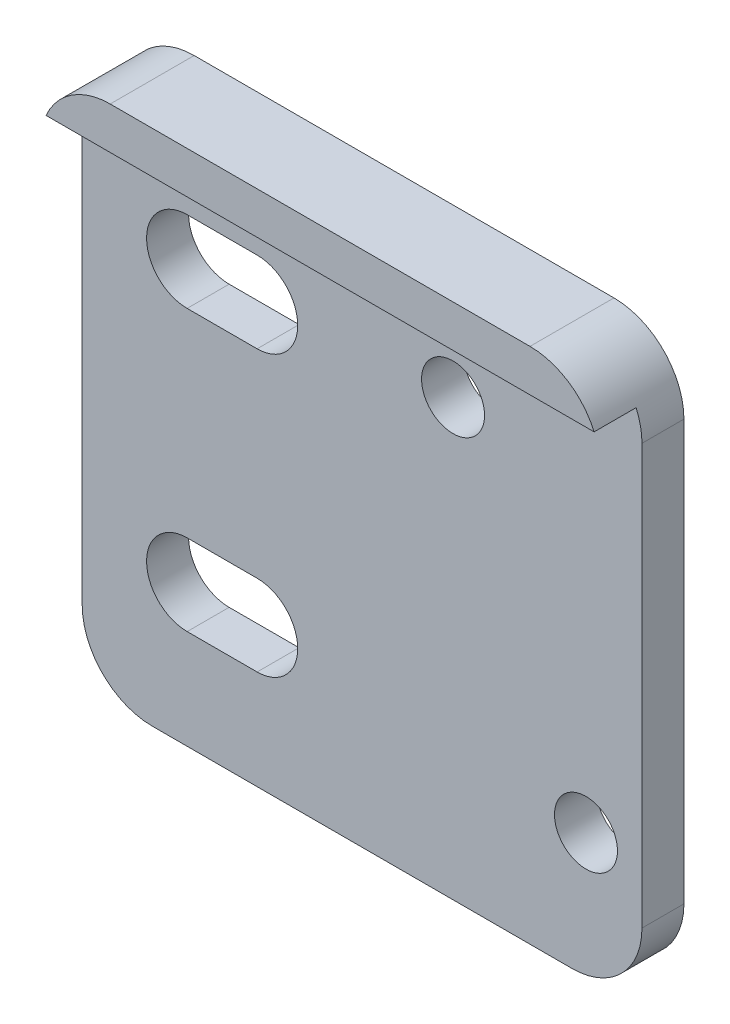
ISO-10303-21;
HEADER;
FILE_DESCRIPTION(('STEP AP214'),'2;1');
FILE_NAME('part.step','',(''),(''),'','','');
FILE_SCHEMA(('AUTOMOTIVE_DESIGN { 1 0 10303 214 1 1 1 1 }'));
ENDSEC;
DATA;
#1=APPLICATION_CONTEXT('core data for automotive mechanical design processes');
#2=APPLICATION_PROTOCOL_DEFINITION('international standard','automotive_design',2000,#1);
#3=PRODUCT_CONTEXT('',#1,'mechanical');
#4=PRODUCT('Part','Part','',(#3));
#5=PRODUCT_RELATED_PRODUCT_CATEGORY('part','',(#4));
#6=PRODUCT_DEFINITION_FORMATION('','',#4);
#7=PRODUCT_DEFINITION_CONTEXT('part definition',#1,'design');
#8=PRODUCT_DEFINITION('design','',#6,#7);
#9=PRODUCT_DEFINITION_SHAPE('','',#8);
#10=(LENGTH_UNIT() NAMED_UNIT(*) SI_UNIT(.MILLI.,.METRE.));
#11=(NAMED_UNIT(*) PLANE_ANGLE_UNIT() SI_UNIT($,.RADIAN.));
#12=(NAMED_UNIT(*) SI_UNIT($,.STERADIAN.) SOLID_ANGLE_UNIT());
#13=UNCERTAINTY_MEASURE_WITH_UNIT(LENGTH_MEASURE(1.E-05),#10,'distance_accuracy_value','');
#14=(GEOMETRIC_REPRESENTATION_CONTEXT(3) GLOBAL_UNCERTAINTY_ASSIGNED_CONTEXT((#13)) GLOBAL_UNIT_ASSIGNED_CONTEXT((#10,
#11,#12)) REPRESENTATION_CONTEXT('',''));
#15=CARTESIAN_POINT('',(0.,0.,0.));
#16=DIRECTION('',(0.,0.,1.));
#17=DIRECTION('',(1.,0.,0.));
#18=AXIS2_PLACEMENT_3D('',#15,#16,#17);
#19=CARTESIAN_POINT('',(0.,0.,3.));
#20=DIRECTION('',(0.,0.,-1.));
#21=DIRECTION('',(-1.,0.,0.));
#22=AXIS2_PLACEMENT_3D('',#19,#20,#21);
#23=PLANE('',#22);
#24=CARTESIAN_POINT('',(36.,8.9,3.));
#25=DIRECTION('',(0.,0.,1.));
#26=DIRECTION('',(1.,0.,0.));
#27=AXIS2_PLACEMENT_3D('',#24,#25,#26);
#28=CIRCLE('',#27,2.25);
#29=CARTESIAN_POINT('',(38.25,8.9,3.));
#30=VERTEX_POINT('',#29);
#31=EDGE_CURVE('E415',#30,#30,#28,.T.);
#32=ORIENTED_EDGE('',*,*,#31,.F.);
#33=EDGE_LOOP('',(#32));
#34=FACE_BOUND('',#33,.T.);
#35=CARTESIAN_POINT('',(26.5,31.1,3.));
#36=DIRECTION('',(0.,0.,1.));
#37=DIRECTION('',(1.,0.,0.));
#38=AXIS2_PLACEMENT_3D('',#35,#36,#37);
#39=CIRCLE('',#38,2.25);
#40=CARTESIAN_POINT('',(28.75,31.1,3.));
#41=VERTEX_POINT('',#40);
#42=EDGE_CURVE('E407',#41,#41,#39,.T.);
#43=ORIENTED_EDGE('',*,*,#42,.F.);
#44=EDGE_LOOP('',(#43));
#45=FACE_BOUND('',#44,.T.);
#46=CARTESIAN_POINT('',(7.5,10.,3.));
#47=DIRECTION('',(0.,0.,1.));
#48=DIRECTION('',(1.,0.,0.));
#49=AXIS2_PLACEMENT_3D('',#46,#47,#48);
#50=CIRCLE('',#49,2.89999999999999);
#51=CARTESIAN_POINT('',(7.5,12.9,3.));
#52=VERTEX_POINT('',#51);
#53=CARTESIAN_POINT('',(7.5,7.1,3.));
#54=VERTEX_POINT('',#53);
#55=EDGE_CURVE('E381',#52,#54,#50,.T.);
#56=ORIENTED_EDGE('',*,*,#55,.F.);
#57=DIRECTION('',(1.,0.,0.));
#58=VECTOR('',#57,1.);
#59=CARTESIAN_POINT('',(7.5,12.9,3.));
#60=LINE('',#59,#58);
#61=CARTESIAN_POINT('',(12.5,12.9,3.));
#62=VERTEX_POINT('',#61);
#63=EDGE_CURVE('E382',#52,#62,#60,.T.);
#64=ORIENTED_EDGE('',*,*,#63,.T.);
#65=CARTESIAN_POINT('',(12.5,10.,3.));
#66=DIRECTION('',(0.,0.,1.));
#67=DIRECTION('',(1.,0.,0.));
#68=AXIS2_PLACEMENT_3D('',#65,#66,#67);
#69=CIRCLE('',#68,2.89999999999999);
#70=CARTESIAN_POINT('',(12.5,7.10000000000001,3.));
#71=VERTEX_POINT('',#70);
#72=EDGE_CURVE('E393',#71,#62,#69,.T.);
#73=ORIENTED_EDGE('',*,*,#72,.F.);
#74=DIRECTION('',(1.,0.,0.));
#75=VECTOR('',#74,1.);
#76=CARTESIAN_POINT('',(7.5,7.10000000000001,3.));
#77=LINE('',#76,#75);
#78=EDGE_CURVE('E372',#54,#71,#77,.T.);
#79=ORIENTED_EDGE('',*,*,#78,.F.);
#80=EDGE_LOOP('',(#56,#64,#73,#79));
#81=FACE_BOUND('',#80,.T.);
#82=DIRECTION('',(1.,0.,0.));
#83=VECTOR('',#82,1.);
#84=CARTESIAN_POINT('',(7.5,27.1,3.));
#85=LINE('',#84,#83);
#86=CARTESIAN_POINT('',(7.5,27.1,3.));
#87=VERTEX_POINT('',#86);
#88=CARTESIAN_POINT('',(12.5,27.1,3.));
#89=VERTEX_POINT('',#88);
#90=EDGE_CURVE('E336',#87,#89,#85,.T.);
#91=ORIENTED_EDGE('',*,*,#90,.F.);
#92=CARTESIAN_POINT('',(7.5,30.,3.));
#93=DIRECTION('',(0.,0.,1.));
#94=DIRECTION('',(1.,0.,0.));
#95=AXIS2_PLACEMENT_3D('',#92,#93,#94);
#96=CIRCLE('',#95,2.89999999999999);
#97=CARTESIAN_POINT('',(7.5,32.9,3.));
#98=VERTEX_POINT('',#97);
#99=EDGE_CURVE('E355',#98,#87,#96,.T.);
#100=ORIENTED_EDGE('',*,*,#99,.F.);
#101=DIRECTION('',(1.,0.,0.));
#102=VECTOR('',#101,1.);
#103=CARTESIAN_POINT('',(7.5,32.9,3.));
#104=LINE('',#103,#102);
#105=CARTESIAN_POINT('',(12.5,32.9,3.));
#106=VERTEX_POINT('',#105);
#107=EDGE_CURVE('E348',#98,#106,#104,.T.);
#108=ORIENTED_EDGE('',*,*,#107,.T.);
#109=CARTESIAN_POINT('',(12.5,30.,3.));
#110=DIRECTION('',(0.,0.,1.));
#111=DIRECTION('',(1.,0.,0.));
#112=AXIS2_PLACEMENT_3D('',#109,#110,#111);
#113=CIRCLE('',#112,2.89999999999999);
#114=EDGE_CURVE('E361',#89,#106,#113,.T.);
#115=ORIENTED_EDGE('',*,*,#114,.F.);
#116=EDGE_LOOP('',(#91,#100,#108,#115));
#117=FACE_BOUND('',#116,.T.);
#118=DIRECTION('',(1.,0.,0.));
#119=VECTOR('',#118,1.);
#120=CARTESIAN_POINT('',(0.417424305044159,37.,3.));
#121=LINE('',#120,#119);
#122=CARTESIAN_POINT('',(0.417424305044159,37.,3.));
#123=VERTEX_POINT('',#122);
#124=CARTESIAN_POINT('',(39.5825756949558,37.,3.));
#125=VERTEX_POINT('',#124);
#126=EDGE_CURVE('E201',#123,#125,#121,.T.);
#127=ORIENTED_EDGE('',*,*,#126,.F.);
#128=CARTESIAN_POINT('',(5.,35.,3.));
#129=DIRECTION('',(0.,0.,-1.));
#130=DIRECTION('',(-1.,0.,0.));
#131=AXIS2_PLACEMENT_3D('',#128,#129,#130);
#132=CIRCLE('',#131,5.);
#133=CARTESIAN_POINT('',(0.,35.,3.));
#134=VERTEX_POINT('',#133);
#135=EDGE_CURVE('E340',#123,#134,#132,.F.);
#136=ORIENTED_EDGE('',*,*,#135,.T.);
#137=DIRECTION('',(0.,-1.,0.));
#138=VECTOR('',#137,1.);
#139=CARTESIAN_POINT('',(0.,0.,3.));
#140=LINE('',#139,#138);
#141=CARTESIAN_POINT('',(0.,5.,3.));
#142=VERTEX_POINT('',#141);
#143=EDGE_CURVE('E416',#134,#142,#140,.T.);
#144=ORIENTED_EDGE('',*,*,#143,.T.);
#145=CARTESIAN_POINT('',(5.,5.,3.));
#146=DIRECTION('',(0.,0.,-1.));
#147=DIRECTION('',(-1.,0.,0.));
#148=AXIS2_PLACEMENT_3D('',#145,#146,#147);
#149=CIRCLE('',#148,5.);
#150=CARTESIAN_POINT('',(5.,0.,3.));
#151=VERTEX_POINT('',#150);
#152=EDGE_CURVE('E457',#142,#151,#149,.F.);
#153=ORIENTED_EDGE('',*,*,#152,.T.);
#154=DIRECTION('',(1.,0.,0.));
#155=VECTOR('',#154,1.);
#156=CARTESIAN_POINT('',(0.,0.,3.));
#157=LINE('',#156,#155);
#158=CARTESIAN_POINT('',(35.,0.,3.));
#159=VERTEX_POINT('',#158);
#160=EDGE_CURVE('E422',#151,#159,#157,.T.);
#161=ORIENTED_EDGE('',*,*,#160,.T.);
#162=CARTESIAN_POINT('',(35.,5.,3.));
#163=DIRECTION('',(0.,0.,-1.));
#164=DIRECTION('',(-1.,0.,0.));
#165=AXIS2_PLACEMENT_3D('',#162,#163,#164);
#166=CIRCLE('',#165,5.);
#167=CARTESIAN_POINT('',(40.,5.,3.));
#168=VERTEX_POINT('',#167);
#169=EDGE_CURVE('E459',#159,#168,#166,.F.);
#170=ORIENTED_EDGE('',*,*,#169,.T.);
#171=DIRECTION('',(0.,1.,0.));
#172=VECTOR('',#171,1.);
#173=CARTESIAN_POINT('',(40.,0.,3.));
#174=LINE('',#173,#172);
#175=CARTESIAN_POINT('',(40.,35.,3.));
#176=VERTEX_POINT('',#175);
#177=EDGE_CURVE('E424',#168,#176,#174,.T.);
#178=ORIENTED_EDGE('',*,*,#177,.T.);
#179=CARTESIAN_POINT('',(35.,35.,3.));
#180=DIRECTION('',(0.,0.,-1.));
#181=DIRECTION('',(-1.,0.,0.));
#182=AXIS2_PLACEMENT_3D('',#179,#180,#181);
#183=CIRCLE('',#182,5.);
#184=EDGE_CURVE('E458',#176,#125,#183,.F.);
#185=ORIENTED_EDGE('',*,*,#184,.T.);
#186=EDGE_LOOP('',(#127,#136,#144,#153,#161,#170,#178,#185));
#187=FACE_BOUND('',#186,.T.);
#188=ADVANCED_FACE('F186',(#34,#45,#81,#117,#187),#23,.F.);
#189=CARTESIAN_POINT('',(0.,0.,0.));
#190=DIRECTION('',(0.,0.,-1.));
#191=DIRECTION('',(-1.,0.,0.));
#192=AXIS2_PLACEMENT_3D('',#189,#190,#191);
#193=PLANE('',#192);
#194=CARTESIAN_POINT('',(12.5,10.,0.));
#195=DIRECTION('',(0.,0.,1.));
#196=DIRECTION('',(1.,0.,0.));
#197=AXIS2_PLACEMENT_3D('',#194,#195,#196);
#198=CIRCLE('',#197,2.89999999999999);
#199=CARTESIAN_POINT('',(12.5,7.1,0.));
#200=VERTEX_POINT('',#199);
#201=CARTESIAN_POINT('',(12.5,12.9,0.));
#202=VERTEX_POINT('',#201);
#203=EDGE_CURVE('E400',#200,#202,#198,.T.);
#204=ORIENTED_EDGE('',*,*,#203,.T.);
#205=DIRECTION('',(1.,0.,0.));
#206=VECTOR('',#205,1.);
#207=CARTESIAN_POINT('',(7.5,12.9,0.));
#208=LINE('',#207,#206);
#209=CARTESIAN_POINT('',(7.5,12.9,0.));
#210=VERTEX_POINT('',#209);
#211=EDGE_CURVE('E378',#210,#202,#208,.T.);
#212=ORIENTED_EDGE('',*,*,#211,.F.);
#213=CARTESIAN_POINT('',(7.5,10.,0.));
#214=DIRECTION('',(0.,0.,1.));
#215=DIRECTION('',(1.,0.,0.));
#216=AXIS2_PLACEMENT_3D('',#213,#214,#215);
#217=CIRCLE('',#216,2.89999999999999);
#218=CARTESIAN_POINT('',(7.5,7.1,0.));
#219=VERTEX_POINT('',#218);
#220=EDGE_CURVE('E387',#210,#219,#217,.T.);
#221=ORIENTED_EDGE('',*,*,#220,.T.);
#222=DIRECTION('',(1.,0.,0.));
#223=VECTOR('',#222,1.);
#224=CARTESIAN_POINT('',(7.5,7.1,0.));
#225=LINE('',#224,#223);
#226=EDGE_CURVE('E376',#219,#200,#225,.T.);
#227=ORIENTED_EDGE('',*,*,#226,.T.);
#228=EDGE_LOOP('',(#204,#212,#221,#227));
#229=FACE_BOUND('',#228,.T.);
#230=CARTESIAN_POINT('',(26.5,31.1,0.));
#231=DIRECTION('',(0.,0.,1.));
#232=DIRECTION('',(1.,0.,0.));
#233=AXIS2_PLACEMENT_3D('',#230,#231,#232);
#234=CIRCLE('',#233,2.25);
#235=CARTESIAN_POINT('',(28.75,31.1,0.));
#236=VERTEX_POINT('',#235);
#237=EDGE_CURVE('E406',#236,#236,#234,.T.);
#238=ORIENTED_EDGE('',*,*,#237,.T.);
#239=EDGE_LOOP('',(#238));
#240=FACE_BOUND('',#239,.T.);
#241=CARTESIAN_POINT('',(36.,8.9,0.));
#242=DIRECTION('',(0.,0.,1.));
#243=DIRECTION('',(1.,0.,0.));
#244=AXIS2_PLACEMENT_3D('',#241,#242,#243);
#245=CIRCLE('',#244,2.25);
#246=CARTESIAN_POINT('',(38.25,8.9,0.));
#247=VERTEX_POINT('',#246);
#248=EDGE_CURVE('E413',#247,#247,#245,.T.);
#249=ORIENTED_EDGE('',*,*,#248,.T.);
#250=EDGE_LOOP('',(#249));
#251=FACE_BOUND('',#250,.T.);
#252=DIRECTION('',(-1.,0.,0.));
#253=VECTOR('',#252,1.);
#254=CARTESIAN_POINT('',(0.,40.,0.));
#255=LINE('',#254,#253);
#256=CARTESIAN_POINT('',(35.,40.,0.));
#257=VERTEX_POINT('',#256);
#258=CARTESIAN_POINT('',(5.,40.,0.));
#259=VERTEX_POINT('',#258);
#260=EDGE_CURVE('E421',#257,#259,#255,.T.);
#261=ORIENTED_EDGE('',*,*,#260,.F.);
#262=CARTESIAN_POINT('',(35.,35.,0.));
#263=DIRECTION('',(0.,0.,-1.));
#264=DIRECTION('',(-1.,0.,0.));
#265=AXIS2_PLACEMENT_3D('',#262,#263,#264);
#266=CIRCLE('',#265,5.);
#267=CARTESIAN_POINT('',(40.,35.,0.));
#268=VERTEX_POINT('',#267);
#269=EDGE_CURVE('E449',#257,#268,#266,.T.);
#270=ORIENTED_EDGE('',*,*,#269,.T.);
#271=DIRECTION('',(0.,1.,0.));
#272=VECTOR('',#271,1.);
#273=CARTESIAN_POINT('',(40.,0.,0.));
#274=LINE('',#273,#272);
#275=CARTESIAN_POINT('',(40.,5.,0.));
#276=VERTEX_POINT('',#275);
#277=EDGE_CURVE('E433',#276,#268,#274,.T.);
#278=ORIENTED_EDGE('',*,*,#277,.F.);
#279=CARTESIAN_POINT('',(35.,5.,0.));
#280=DIRECTION('',(0.,0.,-1.));
#281=DIRECTION('',(-1.,0.,0.));
#282=AXIS2_PLACEMENT_3D('',#279,#280,#281);
#283=CIRCLE('',#282,5.);
#284=CARTESIAN_POINT('',(35.,0.,0.));
#285=VERTEX_POINT('',#284);
#286=EDGE_CURVE('E447',#276,#285,#283,.T.);
#287=ORIENTED_EDGE('',*,*,#286,.T.);
#288=DIRECTION('',(1.,0.,0.));
#289=VECTOR('',#288,1.);
#290=CARTESIAN_POINT('',(0.,0.,0.));
#291=LINE('',#290,#289);
#292=CARTESIAN_POINT('',(5.,0.,0.));
#293=VERTEX_POINT('',#292);
#294=EDGE_CURVE('E431',#293,#285,#291,.T.);
#295=ORIENTED_EDGE('',*,*,#294,.F.);
#296=CARTESIAN_POINT('',(5.,5.,0.));
#297=DIRECTION('',(0.,0.,-1.));
#298=DIRECTION('',(-1.,0.,0.));
#299=AXIS2_PLACEMENT_3D('',#296,#297,#298);
#300=CIRCLE('',#299,5.);
#301=CARTESIAN_POINT('',(0.,5.,0.));
#302=VERTEX_POINT('',#301);
#303=EDGE_CURVE('E443',#293,#302,#300,.T.);
#304=ORIENTED_EDGE('',*,*,#303,.T.);
#305=DIRECTION('',(0.,-1.,0.));
#306=VECTOR('',#305,1.);
#307=CARTESIAN_POINT('',(0.,0.,0.));
#308=LINE('',#307,#306);
#309=CARTESIAN_POINT('',(0.,35.,0.));
#310=VERTEX_POINT('',#309);
#311=EDGE_CURVE('E420',#310,#302,#308,.T.);
#312=ORIENTED_EDGE('',*,*,#311,.F.);
#313=CARTESIAN_POINT('',(5.,35.,0.));
#314=DIRECTION('',(0.,0.,-1.));
#315=DIRECTION('',(-1.,0.,0.));
#316=AXIS2_PLACEMENT_3D('',#313,#314,#315);
#317=CIRCLE('',#316,5.);
#318=EDGE_CURVE('E445',#310,#259,#317,.T.);
#319=ORIENTED_EDGE('',*,*,#318,.T.);
#320=EDGE_LOOP('',(#261,#270,#278,#287,#295,#304,#312,#319));
#321=FACE_BOUND('',#320,.T.);
#322=DIRECTION('',(1.,0.,0.));
#323=VECTOR('',#322,1.);
#324=CARTESIAN_POINT('',(7.5,32.9,0.));
#325=LINE('',#324,#323);
#326=CARTESIAN_POINT('',(7.5,32.9,0.));
#327=VERTEX_POINT('',#326);
#328=CARTESIAN_POINT('',(12.5,32.9,0.));
#329=VERTEX_POINT('',#328);
#330=EDGE_CURVE('E350',#327,#329,#325,.T.);
#331=ORIENTED_EDGE('',*,*,#330,.F.);
#332=CARTESIAN_POINT('',(7.5,30.,0.));
#333=DIRECTION('',(0.,0.,1.));
#334=DIRECTION('',(1.,0.,0.));
#335=AXIS2_PLACEMENT_3D('',#332,#333,#334);
#336=CIRCLE('',#335,2.89999999999999);
#337=CARTESIAN_POINT('',(7.5,27.1,0.));
#338=VERTEX_POINT('',#337);
#339=EDGE_CURVE('E358',#327,#338,#336,.T.);
#340=ORIENTED_EDGE('',*,*,#339,.T.);
#341=DIRECTION('',(1.,0.,0.));
#342=VECTOR('',#341,1.);
#343=CARTESIAN_POINT('',(7.5,27.1,0.));
#344=LINE('',#343,#342);
#345=CARTESIAN_POINT('',(12.5,27.1,0.));
#346=VERTEX_POINT('',#345);
#347=EDGE_CURVE('E338',#338,#346,#344,.T.);
#348=ORIENTED_EDGE('',*,*,#347,.T.);
#349=CARTESIAN_POINT('',(12.5,30.,0.));
#350=DIRECTION('',(0.,0.,1.));
#351=DIRECTION('',(1.,0.,0.));
#352=AXIS2_PLACEMENT_3D('',#349,#350,#351);
#353=CIRCLE('',#352,2.89999999999999);
#354=EDGE_CURVE('E362',#346,#329,#353,.T.);
#355=ORIENTED_EDGE('',*,*,#354,.T.);
#356=EDGE_LOOP('',(#331,#340,#348,#355));
#357=FACE_BOUND('',#356,.T.);
#358=ADVANCED_FACE('F474',(#229,#240,#251,#321,#357),#193,.T.);
#359=CARTESIAN_POINT('',(0.,0.,3.));
#360=DIRECTION('',(1.,0.,0.));
#361=DIRECTION('',(0.,0.,-1.));
#362=AXIS2_PLACEMENT_3D('',#359,#360,#361);
#363=PLANE('',#362);
#364=ORIENTED_EDGE('',*,*,#311,.T.);
#365=DIRECTION('',(0.,0.,-1.));
#366=VECTOR('',#365,1.);
#367=CARTESIAN_POINT('',(0.,5.,3.));
#368=LINE('',#367,#366);
#369=EDGE_CURVE('E13',#302,#142,#368,.F.);
#370=ORIENTED_EDGE('',*,*,#369,.T.);
#371=ORIENTED_EDGE('',*,*,#143,.F.);
#372=DIRECTION('',(0.,0.,-1.));
#373=VECTOR('',#372,1.);
#374=CARTESIAN_POINT('',(0.,35.,3.));
#375=LINE('',#374,#373);
#376=EDGE_CURVE('E200',#134,#310,#375,.T.);
#377=ORIENTED_EDGE('',*,*,#376,.T.);
#378=EDGE_LOOP('',(#364,#370,#371,#377));
#379=FACE_BOUND('',#378,.T.);
#380=ADVANCED_FACE('F469',(#379),#363,.F.);
#381=CARTESIAN_POINT('',(0.,0.,3.));
#382=DIRECTION('',(0.,1.,0.));
#383=DIRECTION('',(0.,0.,1.));
#384=AXIS2_PLACEMENT_3D('',#381,#382,#383);
#385=PLANE('',#384);
#386=ORIENTED_EDGE('',*,*,#294,.T.);
#387=DIRECTION('',(0.,0.,-1.));
#388=VECTOR('',#387,1.);
#389=CARTESIAN_POINT('',(35.,0.,3.));
#390=LINE('',#389,#388);
#391=EDGE_CURVE('E215',#285,#159,#390,.F.);
#392=ORIENTED_EDGE('',*,*,#391,.T.);
#393=ORIENTED_EDGE('',*,*,#160,.F.);
#394=DIRECTION('',(0.,0.,-1.));
#395=VECTOR('',#394,1.);
#396=CARTESIAN_POINT('',(5.,0.,3.));
#397=LINE('',#396,#395);
#398=EDGE_CURVE('E464',#151,#293,#397,.T.);
#399=ORIENTED_EDGE('',*,*,#398,.T.);
#400=EDGE_LOOP('',(#386,#392,#393,#399));
#401=FACE_BOUND('',#400,.T.);
#402=ADVANCED_FACE('F478',(#401),#385,.F.);
#403=CARTESIAN_POINT('',(40.,0.,3.));
#404=DIRECTION('',(-1.,0.,0.));
#405=DIRECTION('',(0.,0.,1.));
#406=AXIS2_PLACEMENT_3D('',#403,#404,#405);
#407=PLANE('',#406);
#408=ORIENTED_EDGE('',*,*,#277,.T.);
#409=DIRECTION('',(0.,0.,-1.));
#410=VECTOR('',#409,1.);
#411=CARTESIAN_POINT('',(40.,35.,3.));
#412=LINE('',#411,#410);
#413=EDGE_CURVE('E454',#268,#176,#412,.F.);
#414=ORIENTED_EDGE('',*,*,#413,.T.);
#415=ORIENTED_EDGE('',*,*,#177,.F.);
#416=DIRECTION('',(0.,0.,-1.));
#417=VECTOR('',#416,1.);
#418=CARTESIAN_POINT('',(40.,5.,3.));
#419=LINE('',#418,#417);
#420=EDGE_CURVE('E448',#168,#276,#419,.T.);
#421=ORIENTED_EDGE('',*,*,#420,.T.);
#422=EDGE_LOOP('',(#408,#414,#415,#421));
#423=FACE_BOUND('',#422,.T.);
#424=ADVANCED_FACE('F486',(#423),#407,.F.);
#425=CARTESIAN_POINT('',(0.,40.,3.));
#426=DIRECTION('',(0.,-1.,0.));
#427=DIRECTION('',(0.,0.,-1.));
#428=AXIS2_PLACEMENT_3D('',#425,#426,#427);
#429=PLANE('',#428);
#430=DIRECTION('',(0.,0.,-1.));
#431=VECTOR('',#430,1.);
#432=CARTESIAN_POINT('',(5.,40.,3.));
#433=LINE('',#432,#431);
#434=CARTESIAN_POINT('',(5.,40.,6.));
#435=VERTEX_POINT('',#434);
#436=EDGE_CURVE('E426',#259,#435,#433,.F.);
#437=ORIENTED_EDGE('',*,*,#436,.T.);
#438=DIRECTION('',(-1.,0.,0.));
#439=VECTOR('',#438,1.);
#440=CARTESIAN_POINT('',(35.,40.,6.));
#441=LINE('',#440,#439);
#442=CARTESIAN_POINT('',(35.,40.,6.));
#443=VERTEX_POINT('',#442);
#444=EDGE_CURVE('E334',#443,#435,#441,.T.);
#445=ORIENTED_EDGE('',*,*,#444,.F.);
#446=DIRECTION('',(0.,0.,-1.));
#447=VECTOR('',#446,1.);
#448=CARTESIAN_POINT('',(35.,40.,3.));
#449=LINE('',#448,#447);
#450=EDGE_CURVE('E437',#443,#257,#449,.T.);
#451=ORIENTED_EDGE('',*,*,#450,.T.);
#452=ORIENTED_EDGE('',*,*,#260,.T.);
#453=EDGE_LOOP('',(#437,#445,#451,#452));
#454=FACE_BOUND('',#453,.T.);
#455=ADVANCED_FACE('F494',(#454),#429,.F.);
#456=CARTESIAN_POINT('',(36.,8.9,3.));
#457=DIRECTION('',(0.,0.,1.));
#458=DIRECTION('',(1.,0.,0.));
#459=AXIS2_PLACEMENT_3D('',#456,#457,#458);
#460=CYLINDRICAL_SURFACE('',#459,2.25);
#461=ORIENTED_EDGE('',*,*,#248,.F.);
#462=EDGE_LOOP('',(#461));
#463=FACE_BOUND('',#462,.T.);
#464=ORIENTED_EDGE('',*,*,#31,.T.);
#465=EDGE_LOOP('',(#464));
#466=FACE_BOUND('',#465,.T.);
#467=ADVANCED_FACE('F498',(#463,#466),#460,.F.);
#468=CARTESIAN_POINT('',(26.5,31.1,3.));
#469=DIRECTION('',(0.,0.,1.));
#470=DIRECTION('',(1.,0.,0.));
#471=AXIS2_PLACEMENT_3D('',#468,#469,#470);
#472=CYLINDRICAL_SURFACE('',#471,2.25);
#473=ORIENTED_EDGE('',*,*,#237,.F.);
#474=EDGE_LOOP('',(#473));
#475=FACE_BOUND('',#474,.T.);
#476=ORIENTED_EDGE('',*,*,#42,.T.);
#477=EDGE_LOOP('',(#476));
#478=FACE_BOUND('',#477,.T.);
#479=ADVANCED_FACE('F504',(#475,#478),#472,.F.);
#480=CARTESIAN_POINT('',(12.5,10.,3.));
#481=DIRECTION('',(0.,0.,1.));
#482=DIRECTION('',(1.,0.,0.));
#483=AXIS2_PLACEMENT_3D('',#480,#481,#482);
#484=CYLINDRICAL_SURFACE('',#483,2.89999999999999);
#485=ORIENTED_EDGE('',*,*,#203,.F.);
#486=DIRECTION('',(0.,0.,1.));
#487=VECTOR('',#486,1.);
#488=CARTESIAN_POINT('',(12.5,7.1,3.));
#489=LINE('',#488,#487);
#490=EDGE_CURVE('E401',#71,#200,#489,.F.);
#491=ORIENTED_EDGE('',*,*,#490,.F.);
#492=ORIENTED_EDGE('',*,*,#72,.T.);
#493=DIRECTION('',(0.,0.,1.));
#494=VECTOR('',#493,1.);
#495=CARTESIAN_POINT('',(12.5,12.9,3.));
#496=LINE('',#495,#494);
#497=EDGE_CURVE('E402',#202,#62,#496,.T.);
#498=ORIENTED_EDGE('',*,*,#497,.F.);
#499=EDGE_LOOP('',(#485,#491,#492,#498));
#500=FACE_BOUND('',#499,.T.);
#501=ADVANCED_FACE('F524',(#500),#484,.F.);
#502=CARTESIAN_POINT('',(7.5,10.,3.));
#503=DIRECTION('',(0.,0.,1.));
#504=DIRECTION('',(1.,0.,0.));
#505=AXIS2_PLACEMENT_3D('',#502,#503,#504);
#506=CYLINDRICAL_SURFACE('',#505,2.89999999999999);
#507=ORIENTED_EDGE('',*,*,#55,.T.);
#508=DIRECTION('',(0.,0.,1.));
#509=VECTOR('',#508,1.);
#510=CARTESIAN_POINT('',(7.5,7.1,3.));
#511=LINE('',#510,#509);
#512=EDGE_CURVE('E386',#219,#54,#511,.T.);
#513=ORIENTED_EDGE('',*,*,#512,.F.);
#514=ORIENTED_EDGE('',*,*,#220,.F.);
#515=DIRECTION('',(0.,0.,1.));
#516=VECTOR('',#515,1.);
#517=CARTESIAN_POINT('',(7.5,12.9,3.));
#518=LINE('',#517,#516);
#519=EDGE_CURVE('E395',#52,#210,#518,.F.);
#520=ORIENTED_EDGE('',*,*,#519,.F.);
#521=EDGE_LOOP('',(#507,#513,#514,#520));
#522=FACE_BOUND('',#521,.T.);
#523=ADVANCED_FACE('F529',(#522),#506,.F.);
#524=CARTESIAN_POINT('',(7.5,12.9,3.));
#525=DIRECTION('',(0.,1.,0.));
#526=DIRECTION('',(0.,0.,1.));
#527=AXIS2_PLACEMENT_3D('',#524,#525,#526);
#528=PLANE('',#527);
#529=ORIENTED_EDGE('',*,*,#497,.T.);
#530=ORIENTED_EDGE('',*,*,#63,.F.);
#531=ORIENTED_EDGE('',*,*,#519,.T.);
#532=ORIENTED_EDGE('',*,*,#211,.T.);
#533=EDGE_LOOP('',(#529,#530,#531,#532));
#534=FACE_BOUND('',#533,.T.);
#535=ADVANCED_FACE('F532',(#534),#528,.F.);
#536=CARTESIAN_POINT('',(7.5,7.1,3.));
#537=DIRECTION('',(0.,-1.,0.));
#538=DIRECTION('',(0.,0.,-1.));
#539=AXIS2_PLACEMENT_3D('',#536,#537,#538);
#540=PLANE('',#539);
#541=ORIENTED_EDGE('',*,*,#490,.T.);
#542=ORIENTED_EDGE('',*,*,#226,.F.);
#543=ORIENTED_EDGE('',*,*,#512,.T.);
#544=ORIENTED_EDGE('',*,*,#78,.T.);
#545=EDGE_LOOP('',(#541,#542,#543,#544));
#546=FACE_BOUND('',#545,.T.);
#547=ADVANCED_FACE('F533',(#546),#540,.F.);
#548=CARTESIAN_POINT('',(12.5,30.,3.));
#549=DIRECTION('',(0.,0.,1.));
#550=DIRECTION('',(1.,0.,0.));
#551=AXIS2_PLACEMENT_3D('',#548,#549,#550);
#552=CYLINDRICAL_SURFACE('',#551,2.89999999999999);
#553=ORIENTED_EDGE('',*,*,#354,.F.);
#554=DIRECTION('',(0.,0.,1.));
#555=VECTOR('',#554,1.);
#556=CARTESIAN_POINT('',(12.5,27.1,3.));
#557=LINE('',#556,#555);
#558=EDGE_CURVE('E371',#89,#346,#557,.F.);
#559=ORIENTED_EDGE('',*,*,#558,.F.);
#560=ORIENTED_EDGE('',*,*,#114,.T.);
#561=DIRECTION('',(0.,0.,1.));
#562=VECTOR('',#561,1.);
#563=CARTESIAN_POINT('',(12.5,32.9,3.));
#564=LINE('',#563,#562);
#565=EDGE_CURVE('E368',#329,#106,#564,.T.);
#566=ORIENTED_EDGE('',*,*,#565,.F.);
#567=EDGE_LOOP('',(#553,#559,#560,#566));
#568=FACE_BOUND('',#567,.T.);
#569=ADVANCED_FACE('F536',(#568),#552,.F.);
#570=CARTESIAN_POINT('',(7.5,30.,3.));
#571=DIRECTION('',(0.,0.,1.));
#572=DIRECTION('',(1.,0.,0.));
#573=AXIS2_PLACEMENT_3D('',#570,#571,#572);
#574=CYLINDRICAL_SURFACE('',#573,2.89999999999999);
#575=ORIENTED_EDGE('',*,*,#99,.T.);
#576=DIRECTION('',(0.,0.,1.));
#577=VECTOR('',#576,1.);
#578=CARTESIAN_POINT('',(7.5,27.1,3.));
#579=LINE('',#578,#577);
#580=EDGE_CURVE('E360',#338,#87,#579,.T.);
#581=ORIENTED_EDGE('',*,*,#580,.F.);
#582=ORIENTED_EDGE('',*,*,#339,.F.);
#583=DIRECTION('',(0.,0.,1.));
#584=VECTOR('',#583,1.);
#585=CARTESIAN_POINT('',(7.5,32.9,3.));
#586=LINE('',#585,#584);
#587=EDGE_CURVE('E363',#98,#327,#586,.F.);
#588=ORIENTED_EDGE('',*,*,#587,.F.);
#589=EDGE_LOOP('',(#575,#581,#582,#588));
#590=FACE_BOUND('',#589,.T.);
#591=ADVANCED_FACE('F544',(#590),#574,.F.);
#592=CARTESIAN_POINT('',(7.5,32.9,3.));
#593=DIRECTION('',(0.,1.,0.));
#594=DIRECTION('',(0.,0.,1.));
#595=AXIS2_PLACEMENT_3D('',#592,#593,#594);
#596=PLANE('',#595);
#597=ORIENTED_EDGE('',*,*,#565,.T.);
#598=ORIENTED_EDGE('',*,*,#107,.F.);
#599=ORIENTED_EDGE('',*,*,#587,.T.);
#600=ORIENTED_EDGE('',*,*,#330,.T.);
#601=EDGE_LOOP('',(#597,#598,#599,#600));
#602=FACE_BOUND('',#601,.T.);
#603=ADVANCED_FACE('F549',(#602),#596,.F.);
#604=CARTESIAN_POINT('',(7.5,27.1,3.));
#605=DIRECTION('',(0.,-1.,0.));
#606=DIRECTION('',(0.,0.,-1.));
#607=AXIS2_PLACEMENT_3D('',#604,#605,#606);
#608=PLANE('',#607);
#609=ORIENTED_EDGE('',*,*,#558,.T.);
#610=ORIENTED_EDGE('',*,*,#347,.F.);
#611=ORIENTED_EDGE('',*,*,#580,.T.);
#612=ORIENTED_EDGE('',*,*,#90,.T.);
#613=EDGE_LOOP('',(#609,#610,#611,#612));
#614=FACE_BOUND('',#613,.T.);
#615=ADVANCED_FACE('F553',(#614),#608,.F.);
#616=CARTESIAN_POINT('',(35.,35.,3.));
#617=DIRECTION('',(0.,0.,-1.));
#618=DIRECTION('',(-1.,0.,0.));
#619=AXIS2_PLACEMENT_3D('',#616,#617,#618);
#620=CYLINDRICAL_SURFACE('',#619,5.);
#621=ORIENTED_EDGE('',*,*,#184,.F.);
#622=ORIENTED_EDGE('',*,*,#413,.F.);
#623=ORIENTED_EDGE('',*,*,#269,.F.);
#624=ORIENTED_EDGE('',*,*,#450,.F.);
#625=CARTESIAN_POINT('',(35.,35.,6.));
#626=DIRECTION('',(0.,0.,1.));
#627=DIRECTION('',(1.,0.,0.));
#628=AXIS2_PLACEMENT_3D('',#625,#626,#627);
#629=CIRCLE('',#628,5.);
#630=CARTESIAN_POINT('',(39.5825756949558,37.,6.));
#631=VERTEX_POINT('',#630);
#632=EDGE_CURVE('E323',#631,#443,#629,.T.);
#633=ORIENTED_EDGE('',*,*,#632,.F.);
#634=DIRECTION('',(0.,0.,-1.));
#635=VECTOR('',#634,1.);
#636=CARTESIAN_POINT('',(39.5825756949558,37.,6.));
#637=LINE('',#636,#635);
#638=EDGE_CURVE('E322',#631,#125,#637,.T.);
#639=ORIENTED_EDGE('',*,*,#638,.T.);
#640=EDGE_LOOP('',(#621,#622,#623,#624,#633,#639));
#641=FACE_BOUND('',#640,.T.);
#642=ADVANCED_FACE('F495',(#641),#620,.T.);
#643=CARTESIAN_POINT('',(35.,5.,3.));
#644=DIRECTION('',(0.,0.,-1.));
#645=DIRECTION('',(-1.,0.,0.));
#646=AXIS2_PLACEMENT_3D('',#643,#644,#645);
#647=CYLINDRICAL_SURFACE('',#646,5.);
#648=ORIENTED_EDGE('',*,*,#169,.F.);
#649=ORIENTED_EDGE('',*,*,#391,.F.);
#650=ORIENTED_EDGE('',*,*,#286,.F.);
#651=ORIENTED_EDGE('',*,*,#420,.F.);
#652=EDGE_LOOP('',(#648,#649,#650,#651));
#653=FACE_BOUND('',#652,.T.);
#654=ADVANCED_FACE('F483',(#653),#647,.T.);
#655=CARTESIAN_POINT('',(5.,5.,3.));
#656=DIRECTION('',(0.,0.,-1.));
#657=DIRECTION('',(-1.,0.,0.));
#658=AXIS2_PLACEMENT_3D('',#655,#656,#657);
#659=CYLINDRICAL_SURFACE('',#658,5.);
#660=ORIENTED_EDGE('',*,*,#152,.F.);
#661=ORIENTED_EDGE('',*,*,#369,.F.);
#662=ORIENTED_EDGE('',*,*,#303,.F.);
#663=ORIENTED_EDGE('',*,*,#398,.F.);
#664=EDGE_LOOP('',(#660,#661,#662,#663));
#665=FACE_BOUND('',#664,.T.);
#666=ADVANCED_FACE('F476',(#665),#659,.T.);
#667=CARTESIAN_POINT('',(5.,35.,3.));
#668=DIRECTION('',(0.,0.,-1.));
#669=DIRECTION('',(-1.,0.,0.));
#670=AXIS2_PLACEMENT_3D('',#667,#668,#669);
#671=CYLINDRICAL_SURFACE('',#670,5.);
#672=ORIENTED_EDGE('',*,*,#135,.F.);
#673=DIRECTION('',(0.,0.,-1.));
#674=VECTOR('',#673,1.);
#675=CARTESIAN_POINT('',(0.417424305044159,37.,6.));
#676=LINE('',#675,#674);
#677=CARTESIAN_POINT('',(0.417424305044159,37.,6.));
#678=VERTEX_POINT('',#677);
#679=EDGE_CURVE('E316',#678,#123,#676,.T.);
#680=ORIENTED_EDGE('',*,*,#679,.F.);
#681=CARTESIAN_POINT('',(5.,35.,6.));
#682=DIRECTION('',(0.,0.,1.));
#683=DIRECTION('',(1.,0.,0.));
#684=AXIS2_PLACEMENT_3D('',#681,#682,#683);
#685=CIRCLE('',#684,5.);
#686=EDGE_CURVE('E327',#435,#678,#685,.T.);
#687=ORIENTED_EDGE('',*,*,#686,.F.);
#688=ORIENTED_EDGE('',*,*,#436,.F.);
#689=ORIENTED_EDGE('',*,*,#318,.F.);
#690=ORIENTED_EDGE('',*,*,#376,.F.);
#691=EDGE_LOOP('',(#672,#680,#687,#688,#689,#690));
#692=FACE_BOUND('',#691,.T.);
#693=ADVANCED_FACE('F192',(#692),#671,.T.);
#694=CARTESIAN_POINT('',(0.417424305044159,37.,6.));
#695=DIRECTION('',(0.,1.,0.));
#696=DIRECTION('',(0.,0.,1.));
#697=AXIS2_PLACEMENT_3D('',#694,#695,#696);
#698=PLANE('',#697);
#699=ORIENTED_EDGE('',*,*,#126,.T.);
#700=ORIENTED_EDGE('',*,*,#638,.F.);
#701=DIRECTION('',(1.,0.,0.));
#702=VECTOR('',#701,1.);
#703=CARTESIAN_POINT('',(0.417424305044159,37.,6.));
#704=LINE('',#703,#702);
#705=EDGE_CURVE('E314',#678,#631,#704,.T.);
#706=ORIENTED_EDGE('',*,*,#705,.F.);
#707=ORIENTED_EDGE('',*,*,#679,.T.);
#708=EDGE_LOOP('',(#699,#700,#706,#707));
#709=FACE_BOUND('',#708,.T.);
#710=ADVANCED_FACE('F320',(#709),#698,.F.);
#711=CARTESIAN_POINT('',(5.,35.,6.));
#712=DIRECTION('',(0.,0.,1.));
#713=DIRECTION('',(1.,0.,0.));
#714=AXIS2_PLACEMENT_3D('',#711,#712,#713);
#715=PLANE('',#714);
#716=ORIENTED_EDGE('',*,*,#686,.T.);
#717=ORIENTED_EDGE('',*,*,#705,.T.);
#718=ORIENTED_EDGE('',*,*,#632,.T.);
#719=ORIENTED_EDGE('',*,*,#444,.T.);
#720=EDGE_LOOP('',(#716,#717,#718,#719));
#721=FACE_BOUND('',#720,.T.);
#722=ADVANCED_FACE('F328',(#721),#715,.T.);
#723=CLOSED_SHELL('',(#188,#358,#380,#402,#424,#455,#467,#479,#501,#523,#535,#547,#569,#591,
#603,#615,#642,#654,#666,#693,#710,#722));
#724=MANIFOLD_SOLID_BREP('B2',#723);
#725=ADVANCED_BREP_SHAPE_REPRESENTATION('',(#18,#724),#14);
#726=SHAPE_DEFINITION_REPRESENTATION(#9,#725);
ENDSEC;
END-ISO-10303-21;
